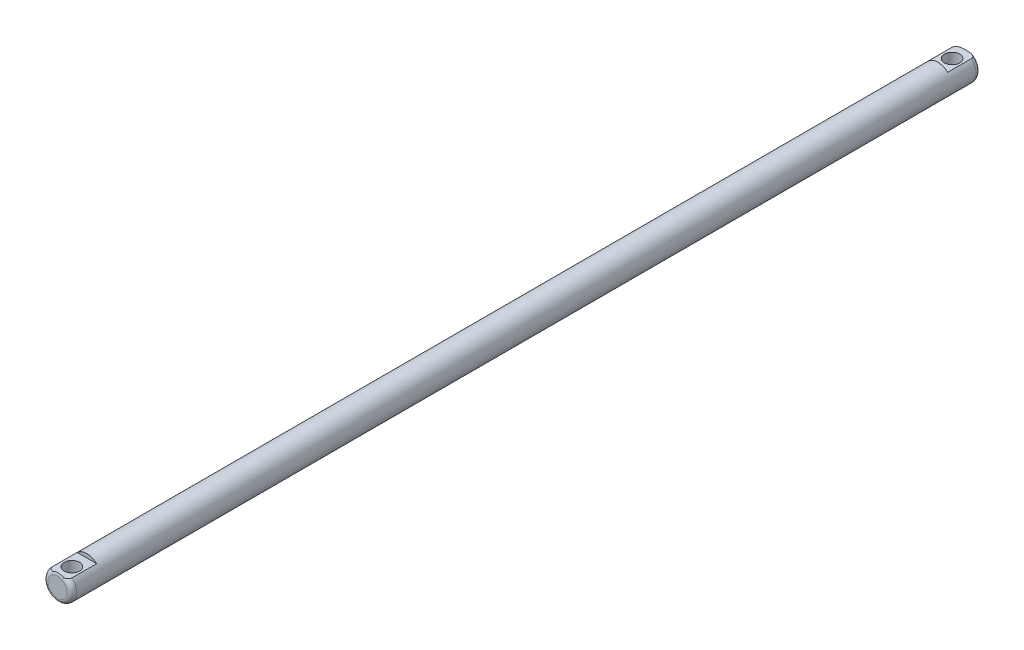
ISO-10303-21;
HEADER;
FILE_DESCRIPTION(('STEP AP214'),'2;1');
FILE_NAME('part.step','',(''),(''),'','','');
FILE_SCHEMA(('AUTOMOTIVE_DESIGN { 1 0 10303 214 1 1 1 1 }'));
ENDSEC;
DATA;
#1=APPLICATION_CONTEXT('core data for automotive mechanical design processes');
#2=APPLICATION_PROTOCOL_DEFINITION('international standard','automotive_design',2000,#1);
#3=PRODUCT_CONTEXT('',#1,'mechanical');
#4=PRODUCT('Part','Part','',(#3));
#5=PRODUCT_RELATED_PRODUCT_CATEGORY('part','',(#4));
#6=PRODUCT_DEFINITION_FORMATION('','',#4);
#7=PRODUCT_DEFINITION_CONTEXT('part definition',#1,'design');
#8=PRODUCT_DEFINITION('design','',#6,#7);
#9=PRODUCT_DEFINITION_SHAPE('','',#8);
#10=(LENGTH_UNIT() NAMED_UNIT(*) SI_UNIT(.MILLI.,.METRE.));
#11=(NAMED_UNIT(*) PLANE_ANGLE_UNIT() SI_UNIT($,.RADIAN.));
#12=(NAMED_UNIT(*) SI_UNIT($,.STERADIAN.) SOLID_ANGLE_UNIT());
#13=UNCERTAINTY_MEASURE_WITH_UNIT(LENGTH_MEASURE(1.E-05),#10,'distance_accuracy_value','');
#14=(GEOMETRIC_REPRESENTATION_CONTEXT(3) GLOBAL_UNCERTAINTY_ASSIGNED_CONTEXT((#13)) GLOBAL_UNIT_ASSIGNED_CONTEXT((#10,
#11,#12)) REPRESENTATION_CONTEXT('',''));
#15=CARTESIAN_POINT('',(0.,0.,0.));
#16=DIRECTION('',(0.,0.,1.));
#17=DIRECTION('',(1.,0.,0.));
#18=AXIS2_PLACEMENT_3D('',#15,#16,#17);
#19=CARTESIAN_POINT('',(-5.91129637087673,0.,95.));
#20=DIRECTION('',(0.,0.,-1.));
#21=DIRECTION('',(-1.,0.,0.));
#22=AXIS2_PLACEMENT_3D('',#19,#20,#21);
#23=CYLINDRICAL_SURFACE('',#22,1.5);
#24=CARTESIAN_POINT('',(-5.91129637087673,-1.5,0.699999999999999));
#25=CARTESIAN_POINT('',(-5.86958236658302,-1.49999758414449,0.700002708289779));
#26=CARTESIAN_POINT('',(-5.82782907962281,-1.49824189360224,0.703281596412438));
#27=CARTESIAN_POINT('',(-5.74557817354222,-1.49139129667971,0.716241700866048));
#28=CARTESIAN_POINT('',(-5.70508260103558,-1.48629121869364,0.725932833003513));
#29=CARTESIAN_POINT('',(-5.62665777593092,-1.47328036800654,0.751219839858311));
#30=CARTESIAN_POINT('',(-5.58871885863916,-1.46538097991501,0.766791814189885));
#31=CARTESIAN_POINT('',(-5.51606089664752,-1.4474774987237,0.803262551711988));
#32=CARTESIAN_POINT('',(-5.48134186656046,-1.43747339607276,0.824161339075601));
#33=CARTESIAN_POINT('',(-5.41352905141709,-1.41547900666031,0.872251561731753));
#34=CARTESIAN_POINT('',(-5.38069434341354,-1.4034011481073,0.89976760351975));
#35=CARTESIAN_POINT('',(-5.31986234021507,-1.37887042167267,0.959603145686749));
#36=CARTESIAN_POINT('',(-5.29186928098036,-1.36641723648963,0.991926806733653));
#37=CARTESIAN_POINT('',(-5.23894195136563,-1.34122140682262,1.06397805847776));
#38=CARTESIAN_POINT('',(-5.21451953384998,-1.32855595701366,1.10411204866305));
#39=CARTESIAN_POINT('',(-5.17286995455973,-1.30586838669548,1.18864568135116));
#40=CARTESIAN_POINT('',(-5.1556372326832,-1.29584422578236,1.23304199480675));
#41=CARTESIAN_POINT('',(-5.13005281920585,-1.28057394848523,1.32205426936129));
#42=CARTESIAN_POINT('',(-5.12121325345194,-1.27506829565278,1.36648297209041));
#43=CARTESIAN_POINT('',(-5.11120139847128,-1.26881331156942,1.45650387196576));
#44=CARTESIAN_POINT('',(-5.11001942391717,-1.26805797215382,1.50209452613423));
#45=CARTESIAN_POINT('',(-5.11500034922747,-1.27118648805135,1.58622186564664));
#46=CARTESIAN_POINT('',(-5.12015314790002,-1.2744325135639,1.62484844662223));
#47=CARTESIAN_POINT('',(-5.13588291580304,-1.28406317281931,1.700574623942));
#48=CARTESIAN_POINT('',(-5.14646206711919,-1.29044906914779,1.73767359950573));
#49=CARTESIAN_POINT('',(-5.17290611848607,-1.30576277857079,1.81033802657356));
#50=CARTESIAN_POINT('',(-5.18888442594585,-1.31474447400447,1.84585030308502));
#51=CARTESIAN_POINT('',(-5.22557984790974,-1.33425047082889,1.9138695263574));
#52=CARTESIAN_POINT('',(-5.24629906233304,-1.34477545505385,1.94637513236902));
#53=CARTESIAN_POINT('',(-5.29542784843988,-1.36804524940245,2.01248586121327));
#54=CARTESIAN_POINT('',(-5.32452007971684,-1.38088899493241,2.04555073524671));
#55=CARTESIAN_POINT('',(-5.38784499750238,-1.40611558623123,2.10657535768995));
#56=CARTESIAN_POINT('',(-5.42208079782726,-1.41849814710228,2.13453199079313));
#57=CARTESIAN_POINT('',(-5.49727429384555,-1.44230010999534,2.18613771491421));
#58=CARTESIAN_POINT('',(-5.53851088646594,-1.45361823088172,2.20943110819391));
#59=CARTESIAN_POINT('',(-5.62506951114058,-1.47310395304255,2.2485478831769));
#60=CARTESIAN_POINT('',(-5.67038785362717,-1.48127436501701,2.26437793200312));
#61=CARTESIAN_POINT('',(-5.75946415692082,-1.4929099561423,2.28667761240728));
#62=CARTESIAN_POINT('',(-5.8029962394947,-1.49673204992477,2.29386070130999));
#63=CARTESIAN_POINT('',(-5.89080677333552,-1.50050221027202,2.30094750320043));
#64=CARTESIAN_POINT('',(-5.93508477816113,-1.50045251716091,2.30085542580229));
#65=CARTESIAN_POINT('',(-6.01884233063734,-1.49667382258832,2.29375007116933));
#66=CARTESIAN_POINT('',(-6.05839282014446,-1.49327897244287,2.28736535925174));
#67=CARTESIAN_POINT('',(-6.13576592570831,-1.48362188327846,2.26889255790208));
#68=CARTESIAN_POINT('',(-6.17358836156398,-1.47735934596487,2.2568038751433));
#69=CARTESIAN_POINT('',(-6.24754653839893,-1.46232570811689,2.22702505753177));
#70=CARTESIAN_POINT('',(-6.2836167042536,-1.4534959496239,2.20920276508172));
#71=CARTESIAN_POINT('',(-6.35235852828769,-1.43413438081761,2.1686248456984));
#72=CARTESIAN_POINT('',(-6.38502885287945,-1.42360190671964,2.1458672936231));
#73=CARTESIAN_POINT('',(-6.44978601548314,-1.40047645695353,2.09325519889227));
#74=CARTESIAN_POINT('',(-6.48143123598498,-1.38778372966929,2.06290033267114));
#75=CARTESIAN_POINT('',(-6.53940623361823,-1.36252708549313,1.99738716408484));
#76=CARTESIAN_POINT('',(-6.56573108635144,-1.34996329805962,1.96222446170796));
#77=CARTESIAN_POINT('',(-6.61403713718564,-1.32549514327965,1.88517351382497));
#78=CARTESIAN_POINT('',(-6.6356066155659,-1.31369210729127,1.84299186122059));
#79=CARTESIAN_POINT('',(-6.6711212190533,-1.29347935062968,1.75478990991383));
#80=CARTESIAN_POINT('',(-6.68507720124621,-1.28506480237657,1.70877518587825));
#81=CARTESIAN_POINT('',(-6.70359182268368,-1.27372513461018,1.61898615290246));
#82=CARTESIAN_POINT('',(-6.70893698242197,-1.27034308682665,1.57543381628454));
#83=CARTESIAN_POINT('',(-6.71240020538841,-1.26816359887642,1.48793968581964));
#84=CARTESIAN_POINT('',(-6.71052319561677,-1.26936303319562,1.44399817787743));
#85=CARTESIAN_POINT('',(-6.70035272162091,-1.27570247677833,1.36265364514195));
#86=CARTESIAN_POINT('',(-6.69286696224713,-1.28034575552508,1.32510510927249));
#87=CARTESIAN_POINT('',(-6.67278980735605,-1.29238691721072,1.25186604245893));
#88=CARTESIAN_POINT('',(-6.66019651837271,-1.29978582163339,1.21617620611579));
#89=CARTESIAN_POINT('',(-6.62937672298915,-1.31707665574429,1.14509522045344));
#90=CARTESIAN_POINT('',(-6.61083957830636,-1.32709848411839,1.10987143258423));
#91=CARTESIAN_POINT('',(-6.56896759755302,-1.34833960706443,1.04279806424025));
#92=CARTESIAN_POINT('',(-6.54563017819009,-1.35955954483521,1.01095031464064));
#93=CARTESIAN_POINT('',(-6.4908799735102,-1.38387269806828,0.946726906119706));
#94=CARTESIAN_POINT('',(-6.45878738922891,-1.39700212075101,0.914941259551169));
#95=CARTESIAN_POINT('',(-6.38944653543655,-1.42222830059072,0.85702772961191));
#96=CARTESIAN_POINT('',(-6.35219495370355,-1.43432438618419,0.8309035088962));
#97=CARTESIAN_POINT('',(-6.27231837349893,-1.45651015109521,0.784566040063342));
#98=CARTESIAN_POINT('',(-6.22958503663064,-1.4665441059256,0.764511373575106));
#99=CARTESIAN_POINT('',(-6.14069570250712,-1.48303856571174,0.732146377266125));
#100=CARTESIAN_POINT('',(-6.09454921780536,-1.48950860714735,0.71981536787766));
#101=CARTESIAN_POINT('',(-6.02510404878421,-1.49584776109147,0.707807328727928));
#102=CARTESIAN_POINT('',(-6.00247411799627,-1.49739944315896,0.704885115798365));
#103=CARTESIAN_POINT('',(-5.95699884832325,-1.49947623062919,0.700980697841471));
#104=CARTESIAN_POINT('',(-5.93415350686746,-1.50000132376498,0.699998515996033));
#105=CARTESIAN_POINT('',(-5.91129637087673,-1.5,0.699999999999999));
#106=B_SPLINE_CURVE_WITH_KNOTS('',3,(#24,#25,#26,#27,#28,#29,#30,#31,#32,#33,#34,#35,#36,#37,
#38,#39,#40,#41,#42,#43,#44,#45,#46,#47,#48,#49,#50,#51,#52,#53,#54,#55,#56,#57,#58,#59,#60,#61,
#62,#63,#64,#65,#66,#67,#68,#69,#70,#71,#72,#73,#74,#75,#76,#77,#78,#79,#80,#81,#82,#83,#84,#85,
#86,#87,#88,#89,#90,#91,#92,#93,#94,#95,#96,#97,#98,#99,#100,#101,#102,#103,#104,#105),
.UNSPECIFIED.,.T.,.F.,(4,2,2,2,2,2,2,2,2,2,2,2,2,2,2,2,2,2,2,2,2,2,2,2,2,2,2,2,2,2,2,2,2,2,2,2,
2,2,2,2,4),(0.,0.125049785968992,0.250293400579708,0.375033395431379,0.499773956363371,
0.632758937517727,0.765859685119313,0.911100210896855,1.0562282067719,1.19228300426694,
1.32816568589672,1.44492819552126,1.5617376954166,1.68117137196064,1.80065805275817,
1.93770170276478,2.07482865313357,2.22012229846782,2.3652859036198,2.49740165319181,
2.62944095746675,2.74950324975936,2.86957803367867,2.99264692026345,3.1157639000882,
3.25213772585141,3.38863720347796,3.53432584534744,3.6798061838978,3.81103787448892,
3.94218005404205,4.0573808881827,4.17262446873054,4.29529226385602,4.41802624681408,
4.55851375899382,4.69909188991155,4.84307664846754,4.98667423094968,5.05519428454422,
5.12371515689634),.UNSPECIFIED.);
#107=CARTESIAN_POINT('',(-5.91129637087673,-1.5,0.699999999999999));
#108=VERTEX_POINT('',#107);
#109=EDGE_CURVE('E134',#108,#108,#106,.T.);
#110=ORIENTED_EDGE('',*,*,#109,.F.);
#111=EDGE_LOOP('',(#110));
#112=FACE_BOUND('',#111,.T.);
#113=CARTESIAN_POINT('',(-5.91129637087673,-1.5,92.7));
#114=CARTESIAN_POINT('',(-5.86958236658302,-1.49999758414449,92.7000027082898));
#115=CARTESIAN_POINT('',(-5.82782907962281,-1.49824189360224,92.7032815964125));
#116=CARTESIAN_POINT('',(-5.74557817354222,-1.49139129667971,92.716241700866));
#117=CARTESIAN_POINT('',(-5.70508260103558,-1.48629121869364,92.7259328330035));
#118=CARTESIAN_POINT('',(-5.62665777593092,-1.47328036800654,92.7512198398583));
#119=CARTESIAN_POINT('',(-5.58871885863916,-1.46538097991501,92.7667918141899));
#120=CARTESIAN_POINT('',(-5.51606089664752,-1.4474774987237,92.803262551712));
#121=CARTESIAN_POINT('',(-5.48134186656047,-1.43747339607277,92.8241613390756));
#122=CARTESIAN_POINT('',(-5.41352905141709,-1.41547900666031,92.8722515617318));
#123=CARTESIAN_POINT('',(-5.38069434341354,-1.4034011481073,92.8997676035198));
#124=CARTESIAN_POINT('',(-5.31986234021507,-1.37887042167267,92.9596031456868));
#125=CARTESIAN_POINT('',(-5.29186928098036,-1.36641723648963,92.9919268067337));
#126=CARTESIAN_POINT('',(-5.23894195136563,-1.34122140682262,93.0639780584778));
#127=CARTESIAN_POINT('',(-5.21451953384998,-1.32855595701365,93.1041120486631));
#128=CARTESIAN_POINT('',(-5.17286995455973,-1.30586838669548,93.1886456813512));
#129=CARTESIAN_POINT('',(-5.1556372326832,-1.29584422578236,93.2330419948068));
#130=CARTESIAN_POINT('',(-5.13005281920585,-1.28057394848524,93.3220542693613));
#131=CARTESIAN_POINT('',(-5.12121325345194,-1.27506829565278,93.3664829720904));
#132=CARTESIAN_POINT('',(-5.11120139847128,-1.26881331156943,93.4565038719658));
#133=CARTESIAN_POINT('',(-5.11001942391718,-1.26805797215382,93.5020945261342));
#134=CARTESIAN_POINT('',(-5.11500034922748,-1.27118648805135,93.5862218656466));
#135=CARTESIAN_POINT('',(-5.12015314790002,-1.2744325135639,93.6248484466222));
#136=CARTESIAN_POINT('',(-5.13588291580304,-1.28406317281931,93.700574623942));
#137=CARTESIAN_POINT('',(-5.14646206711919,-1.29044906914779,93.7376735995057));
#138=CARTESIAN_POINT('',(-5.17290611848607,-1.30576277857079,93.8103380265736));
#139=CARTESIAN_POINT('',(-5.18888442594586,-1.31474447400447,93.845850303085));
#140=CARTESIAN_POINT('',(-5.22557984790974,-1.3342504708289,93.9138695263574));
#141=CARTESIAN_POINT('',(-5.24629906233304,-1.34477545505385,93.946375132369));
#142=CARTESIAN_POINT('',(-5.29542784843989,-1.36804524940246,94.0124858612133));
#143=CARTESIAN_POINT('',(-5.32452007971684,-1.38088899493241,94.0455507352467));
#144=CARTESIAN_POINT('',(-5.38784499750237,-1.40611558623123,94.1065753576899));
#145=CARTESIAN_POINT('',(-5.42208079782726,-1.41849814710228,94.1345319907931));
#146=CARTESIAN_POINT('',(-5.49727429384554,-1.44230010999533,94.1861377149142));
#147=CARTESIAN_POINT('',(-5.53851088646593,-1.45361823088172,94.2094311081939));
#148=CARTESIAN_POINT('',(-5.62506951114057,-1.47310395304255,94.2485478831769));
#149=CARTESIAN_POINT('',(-5.67038785362716,-1.48127436501701,94.2643779320031));
#150=CARTESIAN_POINT('',(-5.75946415692082,-1.4929099561423,94.2866776124073));
#151=CARTESIAN_POINT('',(-5.80299623949469,-1.49673204992477,94.29386070131));
#152=CARTESIAN_POINT('',(-5.89080677333552,-1.50050221027202,94.3009475032004));
#153=CARTESIAN_POINT('',(-5.93508477816112,-1.50045251716091,94.3008554258023));
#154=CARTESIAN_POINT('',(-6.01884233063733,-1.49667382258832,94.2937500711693));
#155=CARTESIAN_POINT('',(-6.05839282014446,-1.49327897244287,94.2873653592517));
#156=CARTESIAN_POINT('',(-6.13576592570831,-1.48362188327846,94.2688925579021));
#157=CARTESIAN_POINT('',(-6.17358836156397,-1.47735934596487,94.2568038751433));
#158=CARTESIAN_POINT('',(-6.24754653839893,-1.46232570811689,94.2270250575318));
#159=CARTESIAN_POINT('',(-6.28361670425359,-1.4534959496239,94.2092027650817));
#160=CARTESIAN_POINT('',(-6.35235852828768,-1.43413438081761,94.1686248456984));
#161=CARTESIAN_POINT('',(-6.38502885287945,-1.42360190671964,94.1458672936231));
#162=CARTESIAN_POINT('',(-6.44978601548314,-1.40047645695353,94.0932551988923));
#163=CARTESIAN_POINT('',(-6.48143123598498,-1.38778372966929,94.0629003326711));
#164=CARTESIAN_POINT('',(-6.53940623361822,-1.36252708549313,93.9973871640848));
#165=CARTESIAN_POINT('',(-6.56573108635144,-1.34996329805962,93.962224461708));
#166=CARTESIAN_POINT('',(-6.61403713718564,-1.32549514327965,93.885173513825));
#167=CARTESIAN_POINT('',(-6.6356066155659,-1.31369210729127,93.8429918612206));
#168=CARTESIAN_POINT('',(-6.6711212190533,-1.29347935062968,93.7547899099138));
#169=CARTESIAN_POINT('',(-6.68507720124621,-1.28506480237658,93.7087751858783));
#170=CARTESIAN_POINT('',(-6.70359182268368,-1.27372513461019,93.6189861529025));
#171=CARTESIAN_POINT('',(-6.70893698242197,-1.27034308682665,93.5754338162845));
#172=CARTESIAN_POINT('',(-6.71240020538841,-1.26816359887642,93.4879396858196));
#173=CARTESIAN_POINT('',(-6.71052319561677,-1.26936303319563,93.4439981778774));
#174=CARTESIAN_POINT('',(-6.7003527216209,-1.27570247677833,93.3626536451419));
#175=CARTESIAN_POINT('',(-6.69286696224713,-1.28034575552509,93.3251051092725));
#176=CARTESIAN_POINT('',(-6.67278980735605,-1.29238691721072,93.2518660424589));
#177=CARTESIAN_POINT('',(-6.66019651837271,-1.29978582163339,93.2161762061158));
#178=CARTESIAN_POINT('',(-6.62937672298914,-1.3170766557443,93.1450952204534));
#179=CARTESIAN_POINT('',(-6.61083957830636,-1.32709848411839,93.1098714325842));
#180=CARTESIAN_POINT('',(-6.56896759755302,-1.34833960706443,93.0427980642403));
#181=CARTESIAN_POINT('',(-6.5456301781901,-1.35955954483521,93.0109503146406));
#182=CARTESIAN_POINT('',(-6.4908799735102,-1.38387269806828,92.9467269061197));
#183=CARTESIAN_POINT('',(-6.45878738922891,-1.39700212075101,92.9149412595512));
#184=CARTESIAN_POINT('',(-6.38944653543655,-1.42222830059072,92.8570277296119));
#185=CARTESIAN_POINT('',(-6.35219495370356,-1.43432438618419,92.8309035088962));
#186=CARTESIAN_POINT('',(-6.27231837349893,-1.45651015109521,92.7845660400633));
#187=CARTESIAN_POINT('',(-6.22958503663064,-1.4665441059256,92.7645113735751));
#188=CARTESIAN_POINT('',(-6.14069570250713,-1.48303856571174,92.7321463772661));
#189=CARTESIAN_POINT('',(-6.09454921780537,-1.48950860714735,92.7198153678777));
#190=CARTESIAN_POINT('',(-6.02510404878422,-1.49584776109147,92.7078073287279));
#191=CARTESIAN_POINT('',(-6.00247411799627,-1.49739944315896,92.7048851157984));
#192=CARTESIAN_POINT('',(-5.95699884832325,-1.49947623062919,92.7009806978415));
#193=CARTESIAN_POINT('',(-5.93415350686746,-1.50000132376498,92.699998515996));
#194=CARTESIAN_POINT('',(-5.91129637087673,-1.5,92.7));
#195=B_SPLINE_CURVE_WITH_KNOTS('',3,(#113,#114,#115,#116,#117,#118,#119,#120,#121,#122,#123,
#124,#125,#126,#127,#128,#129,#130,#131,#132,#133,#134,#135,#136,#137,#138,#139,#140,#141,#142,
#143,#144,#145,#146,#147,#148,#149,#150,#151,#152,#153,#154,#155,#156,#157,#158,#159,#160,#161,
#162,#163,#164,#165,#166,#167,#168,#169,#170,#171,#172,#173,#174,#175,#176,#177,#178,#179,#180,
#181,#182,#183,#184,#185,#186,#187,#188,#189,#190,#191,#192,#193,#194),.UNSPECIFIED.,.T.,.F.,(4,
2,2,2,2,2,2,2,2,2,2,2,2,2,2,2,2,2,2,2,2,2,2,2,2,2,2,2,2,2,2,2,2,2,2,2,2,2,2,2,4),(0.,
0.125049785968991,0.250293400579704,0.375033395431374,0.499773956363369,0.632758937517729,
0.76585968511932,0.911100210896868,1.0562282067719,1.19228300426693,1.3281656858967,
1.44492819552124,1.56173769541658,1.68117137196064,1.80065805275816,1.93770170276476,
2.07482865313355,2.22012229846779,2.36528590361978,2.49740165319179,2.62944095746673,
2.74950324975934,2.86957803367865,2.99264692026343,3.11576390008817,3.25213772585138,
3.38863720347793,3.53432584534742,3.67980618389777,3.8110378744889,3.94218005404203,
4.05738088818267,4.17262446873052,4.29529226385599,4.41802624681405,4.55851375899379,
4.69909188991152,4.84307664846751,4.98667423094964,5.05519428454419,5.12371515689631),.UNSPECIFIED.);
#196=CARTESIAN_POINT('',(-5.91129637087673,-1.5,92.7));
#197=VERTEX_POINT('',#196);
#198=EDGE_CURVE('E125',#197,#197,#195,.T.);
#199=ORIENTED_EDGE('',*,*,#198,.F.);
#200=EDGE_LOOP('',(#199));
#201=FACE_BOUND('',#200,.T.);
#202=DIRECTION('',(0.,0.,-1.));
#203=VECTOR('',#202,1.);
#204=CARTESIAN_POINT('',(-6.93110027359528,1.1,95.));
#205=LINE('',#204,#203);
#206=CARTESIAN_POINT('',(-6.93110027359528,1.1,91.9330127018922));
#207=VERTEX_POINT('',#206);
#208=CARTESIAN_POINT('',(-6.93110027359528,1.1,94.5));
#209=VERTEX_POINT('',#208);
#210=EDGE_CURVE('E99',#207,#209,#205,.F.);
#211=ORIENTED_EDGE('',*,*,#210,.F.);
#212=CARTESIAN_POINT('',(-5.91129637087673,0.,91.9330127018922));
#213=DIRECTION('',(0.,0.,-1.));
#214=DIRECTION('',(-1.,0.,0.));
#215=AXIS2_PLACEMENT_3D('',#212,#213,#214);
#216=CIRCLE('',#215,1.5);
#217=CARTESIAN_POINT('',(-4.89149246815817,1.1,91.9330127018922));
#218=VERTEX_POINT('',#217);
#219=EDGE_CURVE('E11',#207,#218,#216,.T.);
#220=ORIENTED_EDGE('',*,*,#219,.T.);
#221=DIRECTION('',(0.,0.,-1.));
#222=VECTOR('',#221,1.);
#223=CARTESIAN_POINT('',(-4.89149246815817,1.1,95.));
#224=LINE('',#223,#222);
#225=CARTESIAN_POINT('',(-4.89149246815817,1.1,94.5));
#226=VERTEX_POINT('',#225);
#227=EDGE_CURVE('E88',#226,#218,#224,.T.);
#228=ORIENTED_EDGE('',*,*,#227,.F.);
#229=CARTESIAN_POINT('',(-5.91129637087673,0.,94.5));
#230=DIRECTION('',(0.,0.,1.));
#231=DIRECTION('',(1.,0.,0.));
#232=AXIS2_PLACEMENT_3D('',#229,#230,#231);
#233=CIRCLE('',#232,1.5);
#234=EDGE_CURVE('E106',#226,#209,#233,.F.);
#235=ORIENTED_EDGE('',*,*,#234,.T.);
#236=EDGE_LOOP('',(#211,#220,#228,#235));
#237=FACE_BOUND('',#236,.T.);
#238=DIRECTION('',(0.,0.,-1.));
#239=VECTOR('',#238,1.);
#240=CARTESIAN_POINT('',(-4.89149246815817,1.1,95.));
#241=LINE('',#240,#239);
#242=CARTESIAN_POINT('',(-4.89149246815817,1.1,2.98419142114558));
#243=VERTEX_POINT('',#242);
#244=CARTESIAN_POINT('',(-4.89149246815817,1.1,0.5));
#245=VERTEX_POINT('',#244);
#246=EDGE_CURVE('E56',#243,#245,#241,.T.);
#247=ORIENTED_EDGE('',*,*,#246,.F.);
#248=CARTESIAN_POINT('',(-5.91129637087673,0.,2.98419142114559));
#249=DIRECTION('',(0.,0.,1.));
#250=DIRECTION('',(1.,0.,0.));
#251=AXIS2_PLACEMENT_3D('',#248,#249,#250);
#252=CIRCLE('',#251,1.5);
#253=CARTESIAN_POINT('',(-6.93110027359528,1.1,2.98419142114558));
#254=VERTEX_POINT('',#253);
#255=EDGE_CURVE('E49',#243,#254,#252,.T.);
#256=ORIENTED_EDGE('',*,*,#255,.T.);
#257=DIRECTION('',(0.,0.,-1.));
#258=VECTOR('',#257,1.);
#259=CARTESIAN_POINT('',(-6.93110027359528,1.1,95.));
#260=LINE('',#259,#258);
#261=CARTESIAN_POINT('',(-6.93110027359529,1.1,0.500000000000005));
#262=VERTEX_POINT('',#261);
#263=EDGE_CURVE('E113',#262,#254,#260,.F.);
#264=ORIENTED_EDGE('',*,*,#263,.F.);
#265=CARTESIAN_POINT('',(-5.91129637087673,0.,0.5));
#266=DIRECTION('',(0.,0.,1.));
#267=DIRECTION('',(1.,0.,0.));
#268=AXIS2_PLACEMENT_3D('',#265,#266,#267);
#269=CIRCLE('',#268,1.5);
#270=EDGE_CURVE('E225',#262,#245,#269,.T.);
#271=ORIENTED_EDGE('',*,*,#270,.T.);
#272=EDGE_LOOP('',(#247,#256,#264,#271));
#273=FACE_BOUND('',#272,.T.);
#274=ADVANCED_FACE('F39',(#112,#201,#237,#273),#23,.T.);
#275=CARTESIAN_POINT('',(-5.91129637087673,50.,93.5));
#276=DIRECTION('',(0.,-1.,0.));
#277=DIRECTION('',(0.,0.,-1.));
#278=AXIS2_PLACEMENT_3D('',#275,#276,#277);
#279=CYLINDRICAL_SURFACE('',#278,0.799999999999997);
#280=ORIENTED_EDGE('',*,*,#198,.T.);
#281=EDGE_LOOP('',(#280));
#282=FACE_BOUND('',#281,.T.);
#283=CARTESIAN_POINT('',(-5.91129637087673,1.1,93.5));
#284=DIRECTION('',(0.,1.,0.));
#285=DIRECTION('',(0.,0.,1.));
#286=AXIS2_PLACEMENT_3D('',#283,#284,#285);
#287=CIRCLE('',#286,0.799999999999997);
#288=CARTESIAN_POINT('',(-5.91129637087673,1.1,94.3));
#289=VERTEX_POINT('',#288);
#290=EDGE_CURVE('E109',#289,#289,#287,.T.);
#291=ORIENTED_EDGE('',*,*,#290,.T.);
#292=EDGE_LOOP('',(#291));
#293=FACE_BOUND('',#292,.T.);
#294=ADVANCED_FACE('F142',(#282,#293),#279,.F.);
#295=CARTESIAN_POINT('',(-5.91129637087673,50.,1.5));
#296=DIRECTION('',(0.,-1.,0.));
#297=DIRECTION('',(0.,0.,-1.));
#298=AXIS2_PLACEMENT_3D('',#295,#296,#297);
#299=CYLINDRICAL_SURFACE('',#298,0.800000000000001);
#300=ORIENTED_EDGE('',*,*,#109,.T.);
#301=EDGE_LOOP('',(#300));
#302=FACE_BOUND('',#301,.T.);
#303=CARTESIAN_POINT('',(-5.91129637087673,1.1,1.5));
#304=DIRECTION('',(0.,1.,0.));
#305=DIRECTION('',(0.,0.,1.));
#306=AXIS2_PLACEMENT_3D('',#303,#304,#305);
#307=CIRCLE('',#306,0.800000000000001);
#308=CARTESIAN_POINT('',(-5.91129637087673,1.1,2.3));
#309=VERTEX_POINT('',#308);
#310=EDGE_CURVE('E121',#309,#309,#307,.T.);
#311=ORIENTED_EDGE('',*,*,#310,.T.);
#312=EDGE_LOOP('',(#311));
#313=FACE_BOUND('',#312,.T.);
#314=ADVANCED_FACE('F146',(#302,#313),#299,.F.);
#315=CARTESIAN_POINT('',(-5.91129637087673,0.,0.5));
#316=DIRECTION('',(0.,0.,1.));
#317=DIRECTION('',(1.,0.,0.));
#318=AXIS2_PLACEMENT_3D('',#315,#316,#317);
#319=TOROIDAL_SURFACE('',#318,1.,0.5);
#320=CARTESIAN_POINT('',(-5.91129637087673,0.,0.));
#321=DIRECTION('',(0.,0.,1.));
#322=DIRECTION('',(1.,0.,0.));
#323=AXIS2_PLACEMENT_3D('',#320,#321,#322);
#324=CIRCLE('',#323,1.);
#325=CARTESIAN_POINT('',(-4.91129637087673,0.,0.));
#326=VERTEX_POINT('',#325);
#327=EDGE_CURVE('E223',#326,#326,#324,.F.);
#328=ORIENTED_EDGE('',*,*,#327,.F.);
#329=EDGE_LOOP('',(#328));
#330=FACE_BOUND('',#329,.T.);
#331=ORIENTED_EDGE('',*,*,#270,.F.);
#332=CARTESIAN_POINT('',(-5.91129637087673,1.1,0.0101020514433649));
#333=CARTESIAN_POINT('',(-5.87518843118889,1.1,0.0101070075079799));
#334=CARTESIAN_POINT('',(-5.83908108284732,1.1,0.0104570658969568));
#335=CARTESIAN_POINT('',(-5.76687659157532,1.1,0.0119793075569139));
#336=CARTESIAN_POINT('',(-5.7307794509473,1.1,0.0131516125379881));
#337=CARTESIAN_POINT('',(-5.65859710241411,1.1,0.0166340362149047));
#338=CARTESIAN_POINT('',(-5.62251194661611,1.1,0.0189453454820015));
#339=CARTESIAN_POINT('',(-5.55049122333035,1.1,0.0252177707178012));
#340=CARTESIAN_POINT('',(-5.51455561047835,1.1,0.0291783429204451));
#341=CARTESIAN_POINT('',(-5.42935537206833,1.1,0.0413558155539485));
#342=CARTESIAN_POINT('',(-5.38022779654833,1.1,0.0506193642433404));
#343=CARTESIAN_POINT('',(-5.28366260173886,1.1,0.0756898389893435));
#344=CARTESIAN_POINT('',(-5.23622025892807,1.1,0.0914765972794809));
#345=CARTESIAN_POINT('',(-5.16292411123062,1.1,0.124060936612426));
#346=CARTESIAN_POINT('',(-5.13584900592549,1.1,0.138078506706866));
#347=CARTESIAN_POINT('',(-5.08400572370381,1.1,0.169929758097867));
#348=CARTESIAN_POINT('',(-5.05923567421553,1.1,0.187760302292154));
#349=CARTESIAN_POINT('',(-5.01778717658294,1.1,0.223559360242809));
#350=CARTESIAN_POINT('',(-5.00047942399489,1.1,0.240794288181509));
#351=CARTESIAN_POINT('',(-4.96889396287883,1.1,0.277857567673401));
#352=CARTESIAN_POINT('',(-4.95461264166495,1.1,0.297682780927971));
#353=CARTESIAN_POINT('',(-4.93189385390928,1.1,0.336266890580765));
#354=CARTESIAN_POINT('',(-4.9228871152064,1.1,0.354689462725344));
#355=CARTESIAN_POINT('',(-4.90807449145991,1.1,0.39278680958348));
#356=CARTESIAN_POINT('',(-4.90226724216566,1.1,0.412461046593701));
#357=CARTESIAN_POINT('',(-4.8941930317532,1.1,0.452606908869172));
#358=CARTESIAN_POINT('',(-4.89193931290057,1.1,0.473081226710862));
#359=CARTESIAN_POINT('',(-4.89116645939223,1.1,0.514100903446106));
#360=CARTESIAN_POINT('',(-4.89264704216667,1.1,0.534646256847012));
#361=CARTESIAN_POINT('',(-4.89902850457959,1.1,0.573844247698701));
#362=CARTESIAN_POINT('',(-4.90370553334639,1.1,0.592534090460554));
#363=CARTESIAN_POINT('',(-4.91597830724517,1.1,0.628917937485869));
#364=CARTESIAN_POINT('',(-4.92357379036071,1.1,0.64661203098344));
#365=CARTESIAN_POINT('',(-4.94177761673254,1.1,0.681552314992428));
#366=CARTESIAN_POINT('',(-4.9525226596256,1.1,0.698726782267491));
#367=CARTESIAN_POINT('',(-4.9763558362233,1.1,0.7313679252397));
#368=CARTESIAN_POINT('',(-4.98944648528782,1.1,0.746832738479169));
#369=CARTESIAN_POINT('',(-5.02458179078073,1.1,0.783296996446576));
#370=CARTESIAN_POINT('',(-5.04781323234068,1.1,0.80315568901435));
#371=CARTESIAN_POINT('',(-5.09710388470209,1.1,0.838857055471727));
#372=CARTESIAN_POINT('',(-5.12316406816358,1.1,0.854698341693683));
#373=CARTESIAN_POINT('',(-5.1924279678756,1.1,0.890787788726528));
#374=CARTESIAN_POINT('',(-5.23697588752434,1.1,0.908443905319253));
#375=CARTESIAN_POINT('',(-5.30539915472368,1.1,0.929898546616474));
#376=CARTESIAN_POINT('',(-5.32857331466901,1.1,0.936227482893403));
#377=CARTESIAN_POINT('',(-5.37526051112181,1.1,0.947436868583799));
#378=CARTESIAN_POINT('',(-5.39877331203032,1.1,0.95231827843383));
#379=CARTESIAN_POINT('',(-5.46452103650259,1.1,0.964237698429934));
#380=CARTESIAN_POINT('',(-5.50698760669432,1.1,0.969967848683558));
#381=CARTESIAN_POINT('',(-5.59220284112007,1.1,0.978830531561849));
#382=CARTESIAN_POINT('',(-5.63495173710656,1.1,0.981960564160178));
#383=CARTESIAN_POINT('',(-5.7207443522344,1.1,0.986543413205393));
#384=CARTESIAN_POINT('',(-5.76378848148564,1.1,0.987987826769795));
#385=CARTESIAN_POINT('',(-5.84987680217191,1.1,0.989735388863781));
#386=CARTESIAN_POINT('',(-5.89292098471059,1.1,0.990039055114307));
#387=CARTESIAN_POINT('',(-5.97882729992991,1.1,0.989644602483563));
#388=CARTESIAN_POINT('',(-6.02168944956098,1.1,0.988950619910159));
#389=CARTESIAN_POINT('',(-6.10740226948892,1.1,0.986267011101556));
#390=CARTESIAN_POINT('',(-6.15025292121078,1.1,0.984276688170032));
#391=CARTESIAN_POINT('',(-6.23559132945699,1.1,0.978314364076123));
#392=CARTESIAN_POINT('',(-6.27807979108682,1.1,0.974353220289718));
#393=CARTESIAN_POINT('',(-6.36265753703626,1.1,0.963436883871317));
#394=CARTESIAN_POINT('',(-6.40474726014556,1.1,0.956485503826896));
#395=CARTESIAN_POINT('',(-6.46363736847746,1.1,0.943629874157777));
#396=CARTESIAN_POINT('',(-6.48082328481673,1.1,0.939493342652227));
#397=CARTESIAN_POINT('',(-6.51497910802133,1.1,0.930380007138366));
#398=CARTESIAN_POINT('',(-6.53194890039488,1.1,0.925402776179321));
#399=CARTESIAN_POINT('',(-6.5823558228123,1.1,0.909070757885095));
#400=CARTESIAN_POINT('',(-6.61535972347556,1.1,0.89630149715557));
#401=CARTESIAN_POINT('',(-6.67969376466913,1.1,0.865943031273303));
#402=CARTESIAN_POINT('',(-6.71099384235879,1.1,0.848288572643114));
#403=CARTESIAN_POINT('',(-6.7698534435832,1.1,0.807481549354377));
#404=CARTESIAN_POINT('',(-6.79742034963367,1.1,0.784340092513114));
#405=CARTESIAN_POINT('',(-6.83736477833604,1.1,0.742141919329882));
#406=CARTESIAN_POINT('',(-6.85156262181494,1.1,0.724805518517011));
#407=CARTESIAN_POINT('',(-6.87699003422714,1.1,0.68807018132122));
#408=CARTESIAN_POINT('',(-6.88822233123965,1.1,0.668673163753609));
#409=CARTESIAN_POINT('',(-6.90715079305984,1.1,0.628021224874667));
#410=CARTESIAN_POINT('',(-6.91481900214145,1.1,0.606753121888705));
#411=CARTESIAN_POINT('',(-6.92593910522425,1.1,0.563135019397229));
#412=CARTESIAN_POINT('',(-6.92939322167511,1.1,0.540785596635343));
#413=CARTESIAN_POINT('',(-6.93168080675409,1.1,0.498423690803868));
#414=CARTESIAN_POINT('',(-6.93099730498853,1.1,0.478436090792653));
#415=CARTESIAN_POINT('',(-6.92616460357354,1.1,0.438890114560319));
#416=CARTESIAN_POINT('',(-6.92201610198915,1.1,0.419331652698704));
#417=CARTESIAN_POINT('',(-6.91068445773155,1.1,0.381780314521603));
#418=CARTESIAN_POINT('',(-6.90359806055215,1.1,0.363757844939286));
#419=CARTESIAN_POINT('',(-6.88677032222577,1.1,0.329006950724179));
#420=CARTESIAN_POINT('',(-6.87702836711201,1.1,0.312278826494583));
#421=CARTESIAN_POINT('',(-6.8542043443707,1.1,0.278736227047463));
#422=CARTESIAN_POINT('',(-6.84088377156665,1.1,0.262084955369314));
#423=CARTESIAN_POINT('',(-6.81208621646638,1.1,0.23078011589295));
#424=CARTESIAN_POINT('',(-6.79660800928365,1.1,0.216127692253339));
#425=CARTESIAN_POINT('',(-6.75391575456205,1.1,0.180386398734301));
#426=CARTESIAN_POINT('',(-6.72535342188669,1.1,0.160904803768415));
#427=CARTESIAN_POINT('',(-6.66552413965087,1.1,0.126683604505558));
#428=CARTESIAN_POINT('',(-6.63425046315485,1.1,0.111956249027654));
#429=CARTESIAN_POINT('',(-6.54680673671997,1.1,0.07725326937636));
#430=CARTESIAN_POINT('',(-6.48908558636201,1.1,0.0612613140125517));
#431=CARTESIAN_POINT('',(-6.37207938165619,1.1,0.0372601850789086));
#432=CARTESIAN_POINT('',(-6.31278994878478,1.1,0.0292764842558869));
#433=CARTESIAN_POINT('',(-6.19644292363076,1.1,0.0182626369890638));
#434=CARTESIAN_POINT('',(-6.13940227187546,1.1,0.0150294833672693));
#435=CARTESIAN_POINT('',(-6.02533931579551,1.1,0.0109470118378371));
#436=CARTESIAN_POINT('',(-5.96831710598886,1.1,0.0100942249528463));
#437=CARTESIAN_POINT('',(-5.91129637087673,1.1,0.0101020514433649));
#438=B_SPLINE_CURVE_WITH_KNOTS('',3,(#332,#333,#334,#335,#336,#337,#338,#339,#340,#341,#342,
#343,#344,#345,#346,#347,#348,#349,#350,#351,#352,#353,#354,#355,#356,#357,#358,#359,#360,#361,
#362,#363,#364,#365,#366,#367,#368,#369,#370,#371,#372,#373,#374,#375,#376,#377,#378,#379,#380,
#381,#382,#383,#384,#385,#386,#387,#388,#389,#390,#391,#392,#393,#394,#395,#396,#397,#398,#399,
#400,#401,#402,#403,#404,#405,#406,#407,#408,#409,#410,#411,#412,#413,#414,#415,#416,#417,#418,
#419,#420,#421,#422,#423,#424,#425,#426,#427,#428,#429,#430,#431,#432,#433,#434,#435,#436,#437),
.UNSPECIFIED.,.T.,.F.,(4,2,2,2,2,2,2,2,2,2,2,2,2,2,2,2,2,2,2,2,2,2,2,2,2,2,2,2,2,2,2,2,2,2,2,2,
2,2,2,2,2,2,2,2,2,2,2,2,2,2,2,2,4),(0.,0.108320611246238,0.216657259646003,0.325107390466199,
0.433521793285429,0.583234015963904,0.732486797004808,0.823703460489334,0.914845362765316,
0.987849743104755,1.06076648017304,1.12202470113414,1.18325678155766,1.24471650914382,
1.30617158629036,1.36371248221371,1.42124821336902,1.48179054526545,1.54239819384906,
1.63356352620333,1.72476030556412,1.86765181820174,1.93969781386722,2.01169589936523,
2.140117514692,2.26866246559951,2.39784551766527,2.52696993373329,2.65556053424676,
2.78422030070404,2.91217899268104,3.03997501710829,3.09298596357012,3.14602391312986,
3.25188886013575,3.35924248977067,3.46638062201144,3.53335951136279,3.60027656878742,
3.66770999785238,3.73510784813673,3.79480184564159,3.85448381998698,3.91233950803099,
3.97020858371071,4.03394491192795,4.09771757166618,4.20084095107069,4.30422793545209,
4.48287519007793,4.66208890294606,4.8333958237839,5.00445296341724),.UNSPECIFIED.);
#439=EDGE_CURVE('E195',#262,#245,#438,.T.);
#440=ORIENTED_EDGE('',*,*,#439,.T.);
#441=EDGE_LOOP('',(#331,#440));
#442=FACE_BOUND('',#441,.T.);
#443=ADVANCED_FACE('F201',(#330,#442),#319,.T.);
#444=CARTESIAN_POINT('',(-5.91129637087673,0.,94.5));
#445=DIRECTION('',(0.,0.,1.));
#446=DIRECTION('',(1.,0.,0.));
#447=AXIS2_PLACEMENT_3D('',#444,#445,#446);
#448=TOROIDAL_SURFACE('',#447,1.,0.5);
#449=CARTESIAN_POINT('',(-5.91129637087673,0.,95.));
#450=DIRECTION('',(0.,0.,1.));
#451=DIRECTION('',(1.,0.,0.));
#452=AXIS2_PLACEMENT_3D('',#449,#450,#451);
#453=CIRCLE('',#452,1.);
#454=CARTESIAN_POINT('',(-4.91129637087673,0.,95.));
#455=VERTEX_POINT('',#454);
#456=EDGE_CURVE('E190',#455,#455,#453,.T.);
#457=ORIENTED_EDGE('',*,*,#456,.F.);
#458=EDGE_LOOP('',(#457));
#459=FACE_BOUND('',#458,.T.);
#460=CARTESIAN_POINT('',(-5.91129637087673,0.,94.9330127018922));
#461=DIRECTION('',(0.,0.,1.));
#462=DIRECTION('',(1.,0.,0.));
#463=AXIS2_PLACEMENT_3D('',#460,#461,#462);
#464=CIRCLE('',#463,1.25);
#465=CARTESIAN_POINT('',(-6.50501347522859,1.1,94.9330127018922));
#466=VERTEX_POINT('',#465);
#467=CARTESIAN_POINT('',(-5.3175792665203,1.1,94.933012701891));
#468=VERTEX_POINT('',#467);
#469=EDGE_CURVE('E189',#466,#468,#464,.F.);
#470=ORIENTED_EDGE('',*,*,#469,.F.);
#471=CARTESIAN_POINT('',(-5.91129637087673,1.1,94.9898979485566));
#472=CARTESIAN_POINT('',(-5.94740431056457,1.1,94.989892992492));
#473=CARTESIAN_POINT('',(-5.98351165890614,1.1,94.989542934103));
#474=CARTESIAN_POINT('',(-6.05571615017814,1.1,94.9880206924431));
#475=CARTESIAN_POINT('',(-6.09181329080616,1.1,94.986848387462));
#476=CARTESIAN_POINT('',(-6.16399563933935,1.1,94.9833659637851));
#477=CARTESIAN_POINT('',(-6.20008079513735,1.1,94.981054654518));
#478=CARTESIAN_POINT('',(-6.27210151842311,1.1,94.9747822292822));
#479=CARTESIAN_POINT('',(-6.30803713127511,1.1,94.9708216570796));
#480=CARTESIAN_POINT('',(-6.39323736968513,1.1,94.958644184446));
#481=CARTESIAN_POINT('',(-6.44236494520513,1.1,94.9493806357567));
#482=CARTESIAN_POINT('',(-6.5389301400146,1.1,94.9243101610107));
#483=CARTESIAN_POINT('',(-6.58637248282539,1.1,94.9085234027205));
#484=CARTESIAN_POINT('',(-6.65966863052284,1.1,94.8759390633876));
#485=CARTESIAN_POINT('',(-6.68674373582796,1.1,94.8619214932931));
#486=CARTESIAN_POINT('',(-6.73858701804964,1.1,94.8300702419021));
#487=CARTESIAN_POINT('',(-6.76335706753793,1.1,94.8122396977079));
#488=CARTESIAN_POINT('',(-6.80480556517052,1.1,94.7764406397572));
#489=CARTESIAN_POINT('',(-6.82211331775856,1.1,94.7592057118185));
#490=CARTESIAN_POINT('',(-6.85369877887463,1.1,94.7221424323266));
#491=CARTESIAN_POINT('',(-6.86798010008851,1.1,94.702317219072));
#492=CARTESIAN_POINT('',(-6.89069888784418,1.1,94.6637331094192));
#493=CARTESIAN_POINT('',(-6.89970562654706,1.1,94.6453105372747));
#494=CARTESIAN_POINT('',(-6.91451825029355,1.1,94.6072131904165));
#495=CARTESIAN_POINT('',(-6.9203254995878,1.1,94.5875389534063));
#496=CARTESIAN_POINT('',(-6.92839971000026,1.1,94.5473930911308));
#497=CARTESIAN_POINT('',(-6.93065342885288,1.1,94.5269187732891));
#498=CARTESIAN_POINT('',(-6.93142628236123,1.1,94.4858990965539));
#499=CARTESIAN_POINT('',(-6.92994569958678,1.1,94.465353743153));
#500=CARTESIAN_POINT('',(-6.92356423717386,1.1,94.4261557523013));
#501=CARTESIAN_POINT('',(-6.91888720840706,1.1,94.4074659095394));
#502=CARTESIAN_POINT('',(-6.90661443450828,1.1,94.3710820625141));
#503=CARTESIAN_POINT('',(-6.89901895139274,1.1,94.3533879690166));
#504=CARTESIAN_POINT('',(-6.88081512502091,1.1,94.3184476850076));
#505=CARTESIAN_POINT('',(-6.87007008212785,1.1,94.3012732177325));
#506=CARTESIAN_POINT('',(-6.84623690553015,1.1,94.2686320747603));
#507=CARTESIAN_POINT('',(-6.83314625646563,1.1,94.2531672615208));
#508=CARTESIAN_POINT('',(-6.79801095097272,1.1,94.2167030035534));
#509=CARTESIAN_POINT('',(-6.77477950941277,1.1,94.1968443109856));
#510=CARTESIAN_POINT('',(-6.72548885705135,1.1,94.1611429445283));
#511=CARTESIAN_POINT('',(-6.69942867358986,1.1,94.1453016583063));
#512=CARTESIAN_POINT('',(-6.63016477387783,1.1,94.1092122112735));
#513=CARTESIAN_POINT('',(-6.5856168542291,1.1,94.0915560946807));
#514=CARTESIAN_POINT('',(-6.51719358702974,1.1,94.0701014533835));
#515=CARTESIAN_POINT('',(-6.49401942708441,1.1,94.0637725171066));
#516=CARTESIAN_POINT('',(-6.44733223063161,1.1,94.0525631314162));
#517=CARTESIAN_POINT('',(-6.4238194297231,1.1,94.0476817215662));
#518=CARTESIAN_POINT('',(-6.35807170525083,1.1,94.0357623015701));
#519=CARTESIAN_POINT('',(-6.31560513505909,1.1,94.0300321513164));
#520=CARTESIAN_POINT('',(-6.23038990063332,1.1,94.0211694684381));
#521=CARTESIAN_POINT('',(-6.18764100464684,1.1,94.0180394358398));
#522=CARTESIAN_POINT('',(-6.10184838951898,1.1,94.0134565867946));
#523=CARTESIAN_POINT('',(-6.05880426026773,1.1,94.0120121732302));
#524=CARTESIAN_POINT('',(-5.97271593958146,1.1,94.0102646111362));
#525=CARTESIAN_POINT('',(-5.92967175704277,1.1,94.0099609448857));
#526=CARTESIAN_POINT('',(-5.84376544182344,1.1,94.0103553975164));
#527=CARTESIAN_POINT('',(-5.80090329219237,1.1,94.0110493800898));
#528=CARTESIAN_POINT('',(-5.71519047226442,1.1,94.0137329888985));
#529=CARTESIAN_POINT('',(-5.67233982054255,1.1,94.01572331183));
#530=CARTESIAN_POINT('',(-5.58700141229633,1.1,94.0216856359239));
#531=CARTESIAN_POINT('',(-5.5445129506665,1.1,94.0256467797103));
#532=CARTESIAN_POINT('',(-5.45993520471705,1.1,94.0365631161287));
#533=CARTESIAN_POINT('',(-5.41784548160774,1.1,94.0435144961731));
#534=CARTESIAN_POINT('',(-5.35895537327585,1.1,94.0563701258423));
#535=CARTESIAN_POINT('',(-5.34176945693659,1.1,94.0605066573478));
#536=CARTESIAN_POINT('',(-5.307613633732,1.1,94.0696199928617));
#537=CARTESIAN_POINT('',(-5.29064384135846,1.1,94.0745972238207));
#538=CARTESIAN_POINT('',(-5.24023691894106,1.1,94.0909292421149));
#539=CARTESIAN_POINT('',(-5.20723301827782,1.1,94.1036985028445));
#540=CARTESIAN_POINT('',(-5.14289897708428,1.1,94.1340569687267));
#541=CARTESIAN_POINT('',(-5.11159889939464,1.1,94.1517114273569));
#542=CARTESIAN_POINT('',(-5.05273929817026,1.1,94.1925184506456));
#543=CARTESIAN_POINT('',(-5.0251723921198,1.1,94.2156599074869));
#544=CARTESIAN_POINT('',(-4.98522796341743,1.1,94.2578580806701));
#545=CARTESIAN_POINT('',(-4.97103011993853,1.1,94.275194481483));
#546=CARTESIAN_POINT('',(-4.94560270752632,1.1,94.3119298186788));
#547=CARTESIAN_POINT('',(-4.93437041051382,1.1,94.3313268362464));
#548=CARTESIAN_POINT('',(-4.91544194869362,1.1,94.3719787751253));
#549=CARTESIAN_POINT('',(-4.90777373961201,1.1,94.3932468781113));
#550=CARTESIAN_POINT('',(-4.89665363652921,1.1,94.4368649806028));
#551=CARTESIAN_POINT('',(-4.89319952007835,1.1,94.4592144033646));
#552=CARTESIAN_POINT('',(-4.89091193499937,1.1,94.5015763091961));
#553=CARTESIAN_POINT('',(-4.89159543676493,1.1,94.5215639092073));
#554=CARTESIAN_POINT('',(-4.89642813817992,1.1,94.5611098854397));
#555=CARTESIAN_POINT('',(-4.90057663976431,1.1,94.5806683473013));
#556=CARTESIAN_POINT('',(-4.91190828402191,1.1,94.6182196854784));
#557=CARTESIAN_POINT('',(-4.9189946812013,1.1,94.6362421550607));
#558=CARTESIAN_POINT('',(-4.93582241952768,1.1,94.6709930492758));
#559=CARTESIAN_POINT('',(-4.94556437464145,1.1,94.6877211735054));
#560=CARTESIAN_POINT('',(-4.96838839738275,1.1,94.7212637729525));
#561=CARTESIAN_POINT('',(-4.98170897018679,1.1,94.7379150446307));
#562=CARTESIAN_POINT('',(-5.01050652528707,1.1,94.7692198841071));
#563=CARTESIAN_POINT('',(-5.0259847324698,1.1,94.7838723077467));
#564=CARTESIAN_POINT('',(-5.0686769871914,1.1,94.8196136012657));
#565=CARTESIAN_POINT('',(-5.09723931986675,1.1,94.8390951962316));
#566=CARTESIAN_POINT('',(-5.15706860210258,1.1,94.8733163954944));
#567=CARTESIAN_POINT('',(-5.1883422785986,1.1,94.8880437509723));
#568=CARTESIAN_POINT('',(-5.27578600503347,1.1,94.9227467306236));
#569=CARTESIAN_POINT('',(-5.33350715539144,1.1,94.9387386859874));
#570=CARTESIAN_POINT('',(-5.45051336009725,1.1,94.9627398149211));
#571=CARTESIAN_POINT('',(-5.50980279296866,1.1,94.9707235157441));
#572=CARTESIAN_POINT('',(-5.62614981812268,1.1,94.9817373630109));
#573=CARTESIAN_POINT('',(-5.68319046987799,1.1,94.9849705166327));
#574=CARTESIAN_POINT('',(-5.79725342595794,1.1,94.9890529881622));
#575=CARTESIAN_POINT('',(-5.8542756357646,1.1,94.9899057750471));
#576=CARTESIAN_POINT('',(-5.91129637087673,1.1,94.9898979485566));
#577=B_SPLINE_CURVE_WITH_KNOTS('',3,(#471,#472,#473,#474,#475,#476,#477,#478,#479,#480,#481,
#482,#483,#484,#485,#486,#487,#488,#489,#490,#491,#492,#493,#494,#495,#496,#497,#498,#499,#500,
#501,#502,#503,#504,#505,#506,#507,#508,#509,#510,#511,#512,#513,#514,#515,#516,#517,#518,#519,
#520,#521,#522,#523,#524,#525,#526,#527,#528,#529,#530,#531,#532,#533,#534,#535,#536,#537,#538,
#539,#540,#541,#542,#543,#544,#545,#546,#547,#548,#549,#550,#551,#552,#553,#554,#555,#556,#557,
#558,#559,#560,#561,#562,#563,#564,#565,#566,#567,#568,#569,#570,#571,#572,#573,#574,#575,#576),
.UNSPECIFIED.,.T.,.F.,(4,2,2,2,2,2,2,2,2,2,2,2,2,2,2,2,2,2,2,2,2,2,2,2,2,2,2,2,2,2,2,2,2,2,2,2,
2,2,2,2,2,2,2,2,2,2,2,2,2,2,2,2,4),(0.,0.108320611246238,0.216657259646002,0.325107390466199,
0.433521793285432,0.583234015963908,0.732486797004809,0.823703460489332,0.914845362765309,
0.987849743104757,1.06076648017305,1.12202470113414,1.18325678155767,1.24471650914382,
1.30617158629036,1.36371248221373,1.42124821336903,1.48179054526546,1.54239819384907,
1.63356352620335,1.72476030556414,1.86765181820177,1.93969781386726,2.01169589936527,
2.14011751469206,2.26866246559958,2.39784551766536,2.52696993373339,2.65556053424687,
2.78422030070417,2.91217899268118,3.03997501710846,3.09298596357026,3.14602391312998,
3.25188886013582,3.35924248977068,3.46638062201142,3.53335951136278,3.6002765687874,
3.66770999785237,3.73510784813672,3.79480184564158,3.85448381998699,3.91233950803098,
3.97020858371069,4.03394491192794,4.09771757166618,4.20084095107068,4.30422793545208,
4.48287519007792,4.66208890294604,4.83339582378389,5.00445296341725),.UNSPECIFIED.);
#578=EDGE_CURVE('E191',#466,#209,#577,.T.);
#579=ORIENTED_EDGE('',*,*,#578,.T.);
#580=ORIENTED_EDGE('',*,*,#234,.F.);
#581=EDGE_CURVE('E94',#226,#468,#577,.T.);
#582=ORIENTED_EDGE('',*,*,#581,.T.);
#583=EDGE_LOOP('',(#470,#579,#580,#582));
#584=FACE_BOUND('',#583,.T.);
#585=ADVANCED_FACE('F41',(#459,#584),#448,.T.);
#586=CARTESIAN_POINT('',(-5.91129637087673,0.,95.));
#587=DIRECTION('',(0.,0.,1.));
#588=DIRECTION('',(1.,0.,0.));
#589=AXIS2_PLACEMENT_3D('',#586,#587,#588);
#590=PLANE('',#589);
#591=ORIENTED_EDGE('',*,*,#456,.T.);
#592=EDGE_LOOP('',(#591));
#593=FACE_BOUND('',#592,.T.);
#594=ADVANCED_FACE('F150',(#593),#590,.T.);
#595=CARTESIAN_POINT('',(-5.91129637087673,0.,0.));
#596=DIRECTION('',(0.,0.,1.));
#597=DIRECTION('',(1.,0.,0.));
#598=AXIS2_PLACEMENT_3D('',#595,#596,#597);
#599=PLANE('',#598);
#600=ORIENTED_EDGE('',*,*,#327,.T.);
#601=EDGE_LOOP('',(#600));
#602=FACE_BOUND('',#601,.T.);
#603=ADVANCED_FACE('F152',(#602),#599,.F.);
#604=CARTESIAN_POINT('',(-7.16129637087673,1.1,91.9330127018922));
#605=DIRECTION('',(0.,0.,-1.));
#606=DIRECTION('',(-1.,0.,0.));
#607=AXIS2_PLACEMENT_3D('',#604,#605,#606);
#608=PLANE('',#607);
#609=DIRECTION('',(-1.,0.,0.));
#610=VECTOR('',#609,1.);
#611=CARTESIAN_POINT('',(-7.16129637087673,1.1,91.9330127018922));
#612=LINE('',#611,#610);
#613=EDGE_CURVE('E91',#218,#207,#612,.T.);
#614=ORIENTED_EDGE('',*,*,#613,.F.);
#615=ORIENTED_EDGE('',*,*,#219,.F.);
#616=EDGE_LOOP('',(#614,#615));
#617=FACE_BOUND('',#616,.T.);
#618=ADVANCED_FACE('F102',(#617),#608,.F.);
#619=CARTESIAN_POINT('',(0.,1.1,0.));
#620=DIRECTION('',(0.,1.,0.));
#621=DIRECTION('',(0.,0.,1.));
#622=AXIS2_PLACEMENT_3D('',#619,#620,#621);
#623=PLANE('',#622);
#624=ORIENTED_EDGE('',*,*,#290,.F.);
#625=EDGE_LOOP('',(#624));
#626=FACE_BOUND('',#625,.T.);
#627=ORIENTED_EDGE('',*,*,#210,.T.);
#628=ORIENTED_EDGE('',*,*,#578,.F.);
#629=DIRECTION('',(1.,0.,0.));
#630=VECTOR('',#629,1.);
#631=CARTESIAN_POINT('',(-7.16129637087673,1.1,94.9330127018922));
#632=LINE('',#631,#630);
#633=EDGE_CURVE('E64',#466,#468,#632,.T.);
#634=ORIENTED_EDGE('',*,*,#633,.T.);
#635=ORIENTED_EDGE('',*,*,#581,.F.);
#636=ORIENTED_EDGE('',*,*,#227,.T.);
#637=ORIENTED_EDGE('',*,*,#613,.T.);
#638=EDGE_LOOP('',(#627,#628,#634,#635,#636,#637));
#639=FACE_BOUND('',#638,.T.);
#640=ADVANCED_FACE('F90',(#626,#639),#623,.T.);
#641=CARTESIAN_POINT('',(-7.16129637087673,1.1,94.9330127018922));
#642=DIRECTION('',(0.,0.,1.));
#643=DIRECTION('',(1.,0.,0.));
#644=AXIS2_PLACEMENT_3D('',#641,#642,#643);
#645=PLANE('',#644);
#646=ORIENTED_EDGE('',*,*,#469,.T.);
#647=ORIENTED_EDGE('',*,*,#633,.F.);
#648=EDGE_LOOP('',(#646,#647));
#649=FACE_BOUND('',#648,.T.);
#650=ADVANCED_FACE('F173',(#649),#645,.F.);
#651=CARTESIAN_POINT('',(-7.16129637087673,1.1,2.98419142114558));
#652=DIRECTION('',(0.,0.,1.));
#653=DIRECTION('',(1.,0.,0.));
#654=AXIS2_PLACEMENT_3D('',#651,#652,#653);
#655=PLANE('',#654);
#656=DIRECTION('',(1.,0.,0.));
#657=VECTOR('',#656,1.);
#658=CARTESIAN_POINT('',(-7.16129637087673,1.1,2.98419142114558));
#659=LINE('',#658,#657);
#660=EDGE_CURVE('E212',#254,#243,#659,.T.);
#661=ORIENTED_EDGE('',*,*,#660,.F.);
#662=ORIENTED_EDGE('',*,*,#255,.F.);
#663=EDGE_LOOP('',(#661,#662));
#664=FACE_BOUND('',#663,.T.);
#665=ADVANCED_FACE('F178',(#664),#655,.F.);
#666=CARTESIAN_POINT('',(0.,1.1,0.));
#667=DIRECTION('',(0.,1.,0.));
#668=DIRECTION('',(0.,0.,1.));
#669=AXIS2_PLACEMENT_3D('',#666,#667,#668);
#670=PLANE('',#669);
#671=ORIENTED_EDGE('',*,*,#310,.F.);
#672=EDGE_LOOP('',(#671));
#673=FACE_BOUND('',#672,.T.);
#674=ORIENTED_EDGE('',*,*,#246,.T.);
#675=ORIENTED_EDGE('',*,*,#439,.F.);
#676=ORIENTED_EDGE('',*,*,#263,.T.);
#677=ORIENTED_EDGE('',*,*,#660,.T.);
#678=EDGE_LOOP('',(#674,#675,#676,#677));
#679=FACE_BOUND('',#678,.T.);
#680=ADVANCED_FACE('F203',(#673,#679),#670,.T.);
#681=CLOSED_SHELL('',(#274,#294,#314,#443,#585,#594,#603,#618,#640,#650,#665,#680));
#682=MANIFOLD_SOLID_BREP('B2',#681);
#683=ADVANCED_BREP_SHAPE_REPRESENTATION('',(#18,#682),#14);
#684=SHAPE_DEFINITION_REPRESENTATION(#9,#683);
ENDSEC;
END-ISO-10303-21;
